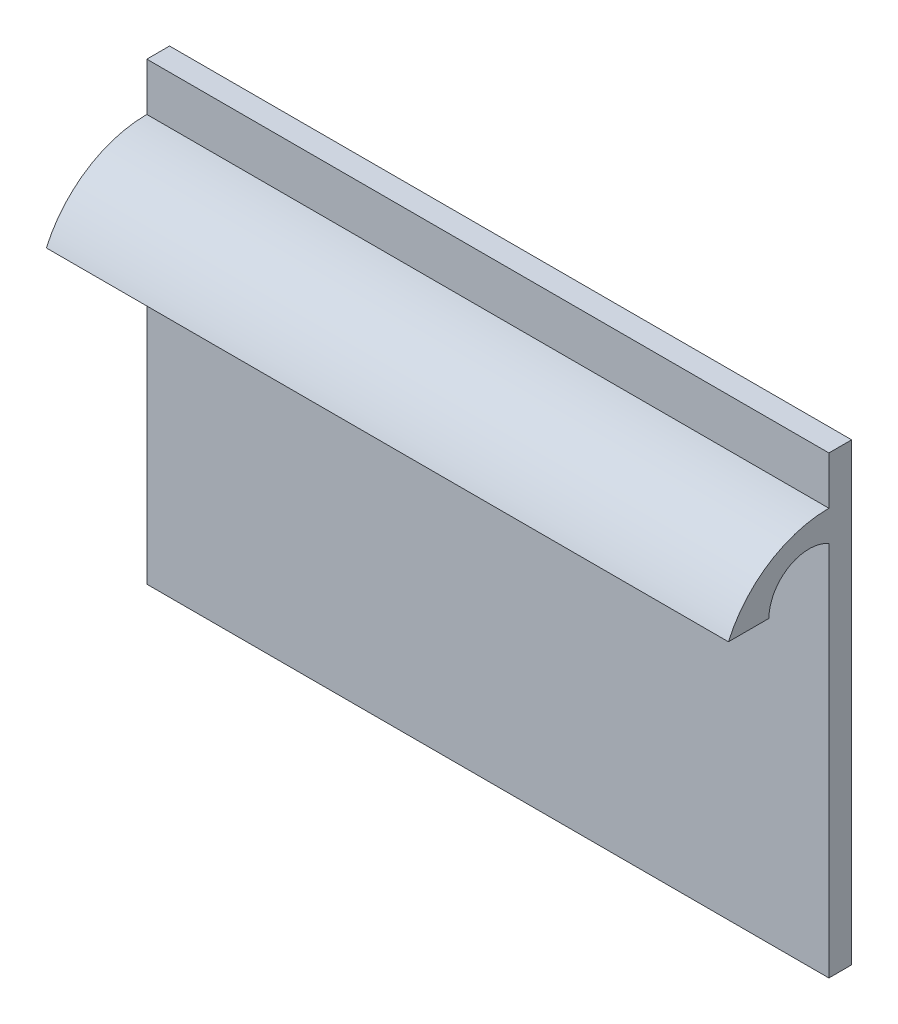
ISO-10303-21;
HEADER;
FILE_DESCRIPTION(('STEP AP214'),'2;1');
FILE_NAME('part.step','',(''),(''),'','','');
FILE_SCHEMA(('AUTOMOTIVE_DESIGN { 1 0 10303 214 1 1 1 1 }'));
ENDSEC;
DATA;
#1=APPLICATION_CONTEXT('core data for automotive mechanical design processes');
#2=APPLICATION_PROTOCOL_DEFINITION('international standard','automotive_design',2000,#1);
#3=PRODUCT_CONTEXT('',#1,'mechanical');
#4=PRODUCT('Part','Part','',(#3));
#5=PRODUCT_RELATED_PRODUCT_CATEGORY('part','',(#4));
#6=PRODUCT_DEFINITION_FORMATION('','',#4);
#7=PRODUCT_DEFINITION_CONTEXT('part definition',#1,'design');
#8=PRODUCT_DEFINITION('design','',#6,#7);
#9=PRODUCT_DEFINITION_SHAPE('','',#8);
#10=(LENGTH_UNIT() NAMED_UNIT(*) SI_UNIT(.MILLI.,.METRE.));
#11=(NAMED_UNIT(*) PLANE_ANGLE_UNIT() SI_UNIT($,.RADIAN.));
#12=(NAMED_UNIT(*) SI_UNIT($,.STERADIAN.) SOLID_ANGLE_UNIT());
#13=UNCERTAINTY_MEASURE_WITH_UNIT(LENGTH_MEASURE(1.E-05),#10,'distance_accuracy_value','');
#14=(GEOMETRIC_REPRESENTATION_CONTEXT(3) GLOBAL_UNCERTAINTY_ASSIGNED_CONTEXT((#13)) GLOBAL_UNIT_ASSIGNED_CONTEXT((#10,
#11,#12)) REPRESENTATION_CONTEXT('',''));
#15=CARTESIAN_POINT('',(0.,0.,0.));
#16=DIRECTION('',(0.,0.,1.));
#17=DIRECTION('',(1.,0.,0.));
#18=AXIS2_PLACEMENT_3D('',#15,#16,#17);
#19=CARTESIAN_POINT('',(0.,0.,10.));
#20=DIRECTION('',(0.,0.,1.));
#21=DIRECTION('',(1.,0.,0.));
#22=AXIS2_PLACEMENT_3D('',#19,#20,#21);
#23=PLANE('',#22);
#24=DIRECTION('',(0.,-1.,0.));
#25=VECTOR('',#24,1.);
#26=CARTESIAN_POINT('',(-150.,100.,10.));
#27=LINE('',#26,#25);
#28=CARTESIAN_POINT('',(-150.,100.,10.));
#29=VERTEX_POINT('',#28);
#30=CARTESIAN_POINT('',(-150.,78.9331796581173,10.));
#31=VERTEX_POINT('',#30);
#32=EDGE_CURVE('E147',#29,#31,#27,.T.);
#33=ORIENTED_EDGE('',*,*,#32,.T.);
#34=DIRECTION('',(1.,0.,0.));
#35=VECTOR('',#34,1.);
#36=CARTESIAN_POINT('',(-150.,78.9331796581173,10.));
#37=LINE('',#36,#35);
#38=CARTESIAN_POINT('',(150.,78.9331796581174,10.));
#39=VERTEX_POINT('',#38);
#40=EDGE_CURVE('E128',#31,#39,#37,.T.);
#41=ORIENTED_EDGE('',*,*,#40,.T.);
#42=DIRECTION('',(0.,1.,0.));
#43=VECTOR('',#42,1.);
#44=CARTESIAN_POINT('',(150.,100.,10.));
#45=LINE('',#44,#43);
#46=CARTESIAN_POINT('',(150.,100.,10.));
#47=VERTEX_POINT('',#46);
#48=EDGE_CURVE('E85',#39,#47,#45,.T.);
#49=ORIENTED_EDGE('',*,*,#48,.T.);
#50=DIRECTION('',(-1.,0.,0.));
#51=VECTOR('',#50,1.);
#52=CARTESIAN_POINT('',(-150.,100.,10.));
#53=LINE('',#52,#51);
#54=EDGE_CURVE('E144',#47,#29,#53,.T.);
#55=ORIENTED_EDGE('',*,*,#54,.T.);
#56=EDGE_LOOP('',(#33,#41,#49,#55));
#57=FACE_BOUND('',#56,.T.);
#58=ADVANCED_FACE('F33',(#57),#23,.T.);
#59=CARTESIAN_POINT('',(150.,100.,10.));
#60=DIRECTION('',(-1.,0.,0.));
#61=DIRECTION('',(0.,-1.,0.));
#62=AXIS2_PLACEMENT_3D('',#59,#60,#61);
#63=PLANE('',#62);
#64=DIRECTION('',(0.,1.,0.));
#65=VECTOR('',#64,1.);
#66=CARTESIAN_POINT('',(150.,100.,0.));
#67=LINE('',#66,#65);
#68=CARTESIAN_POINT('',(150.,-100.,0.));
#69=VERTEX_POINT('',#68);
#70=CARTESIAN_POINT('',(150.,100.,0.));
#71=VERTEX_POINT('',#70);
#72=EDGE_CURVE('E138',#69,#71,#67,.T.);
#73=ORIENTED_EDGE('',*,*,#72,.T.);
#74=DIRECTION('',(0.,0.,-1.));
#75=VECTOR('',#74,1.);
#76=CARTESIAN_POINT('',(150.,100.,10.));
#77=LINE('',#76,#75);
#78=EDGE_CURVE('E11',#47,#71,#77,.T.);
#79=ORIENTED_EDGE('',*,*,#78,.F.);
#80=ORIENTED_EDGE('',*,*,#48,.F.);
#81=CARTESIAN_POINT('',(150.,30.6384327201429,10.));
#82=DIRECTION('',(1.,0.,0.));
#83=DIRECTION('',(0.,1.,0.));
#84=AXIS2_PLACEMENT_3D('',#81,#82,#83);
#85=CIRCLE('',#84,48.2947469379745);
#86=CARTESIAN_POINT('',(150.,50.1540026500254,54.1760694507203));
#87=VERTEX_POINT('',#86);
#88=EDGE_CURVE('E48',#39,#87,#85,.T.);
#89=ORIENTED_EDGE('',*,*,#88,.T.);
#90=DIRECTION('',(0.,0.,-1.));
#91=VECTOR('',#90,1.);
#92=CARTESIAN_POINT('',(150.,50.1540026500254,54.1760694507203));
#93=LINE('',#92,#91);
#94=CARTESIAN_POINT('',(150.,50.1540026500254,36.3617437842129));
#95=VERTEX_POINT('',#94);
#96=EDGE_CURVE('E113',#87,#95,#93,.T.);
#97=ORIENTED_EDGE('',*,*,#96,.T.);
#98=CARTESIAN_POINT('',(150.,50.1540026500254,18.7016400697343));
#99=DIRECTION('',(-1.,0.,0.));
#100=DIRECTION('',(0.,-1.,0.));
#101=AXIS2_PLACEMENT_3D('',#98,#99,#100);
#102=CIRCLE('',#101,17.6601037144786);
#103=CARTESIAN_POINT('',(150.,65.5215243533755,10.));
#104=VERTEX_POINT('',#103);
#105=EDGE_CURVE('E129',#95,#104,#102,.T.);
#106=ORIENTED_EDGE('',*,*,#105,.T.);
#107=CARTESIAN_POINT('',(150.,-100.,10.));
#108=VERTEX_POINT('',#107);
#109=EDGE_CURVE('E142',#108,#104,#45,.T.);
#110=ORIENTED_EDGE('',*,*,#109,.F.);
#111=DIRECTION('',(0.,0.,-1.));
#112=VECTOR('',#111,1.);
#113=CARTESIAN_POINT('',(150.,-100.,10.));
#114=LINE('',#113,#112);
#115=EDGE_CURVE('E150',#108,#69,#114,.T.);
#116=ORIENTED_EDGE('',*,*,#115,.T.);
#117=EDGE_LOOP('',(#73,#79,#80,#89,#97,#106,#110,#116));
#118=FACE_BOUND('',#117,.T.);
#119=ADVANCED_FACE('F35',(#118),#63,.F.);
#120=CARTESIAN_POINT('',(-150.,100.,10.));
#121=DIRECTION('',(0.,-1.,0.));
#122=DIRECTION('',(0.,0.,-1.));
#123=AXIS2_PLACEMENT_3D('',#120,#121,#122);
#124=PLANE('',#123);
#125=DIRECTION('',(-1.,0.,0.));
#126=VECTOR('',#125,1.);
#127=CARTESIAN_POINT('',(-150.,100.,0.));
#128=LINE('',#127,#126);
#129=CARTESIAN_POINT('',(-150.,100.,0.));
#130=VERTEX_POINT('',#129);
#131=EDGE_CURVE('E153',#71,#130,#128,.T.);
#132=ORIENTED_EDGE('',*,*,#131,.T.);
#133=DIRECTION('',(0.,0.,-1.));
#134=VECTOR('',#133,1.);
#135=CARTESIAN_POINT('',(-150.,100.,10.));
#136=LINE('',#135,#134);
#137=EDGE_CURVE('E41',#29,#130,#136,.T.);
#138=ORIENTED_EDGE('',*,*,#137,.F.);
#139=ORIENTED_EDGE('',*,*,#54,.F.);
#140=ORIENTED_EDGE('',*,*,#78,.T.);
#141=EDGE_LOOP('',(#132,#138,#139,#140));
#142=FACE_BOUND('',#141,.T.);
#143=ADVANCED_FACE('F190',(#142),#124,.F.);
#144=CARTESIAN_POINT('',(-150.,100.,10.));
#145=DIRECTION('',(1.,0.,0.));
#146=DIRECTION('',(0.,1.,0.));
#147=AXIS2_PLACEMENT_3D('',#144,#145,#146);
#148=PLANE('',#147);
#149=DIRECTION('',(0.,-1.,0.));
#150=VECTOR('',#149,1.);
#151=CARTESIAN_POINT('',(-150.,100.,0.));
#152=LINE('',#151,#150);
#153=CARTESIAN_POINT('',(-150.,-100.,0.));
#154=VERTEX_POINT('',#153);
#155=EDGE_CURVE('E155',#130,#154,#152,.T.);
#156=ORIENTED_EDGE('',*,*,#155,.T.);
#157=DIRECTION('',(0.,0.,-1.));
#158=VECTOR('',#157,1.);
#159=CARTESIAN_POINT('',(-150.,-100.,10.));
#160=LINE('',#159,#158);
#161=CARTESIAN_POINT('',(-150.,-100.,10.));
#162=VERTEX_POINT('',#161);
#163=EDGE_CURVE('E159',#162,#154,#160,.T.);
#164=ORIENTED_EDGE('',*,*,#163,.F.);
#165=CARTESIAN_POINT('',(-150.,65.5215243533754,10.));
#166=VERTEX_POINT('',#165);
#167=EDGE_CURVE('E146',#166,#162,#27,.T.);
#168=ORIENTED_EDGE('',*,*,#167,.F.);
#169=CARTESIAN_POINT('',(-150.,50.1540026500253,18.7016400697343));
#170=DIRECTION('',(-1.,0.,0.));
#171=DIRECTION('',(0.,-1.,0.));
#172=AXIS2_PLACEMENT_3D('',#169,#170,#171);
#173=CIRCLE('',#172,17.6601037144786);
#174=CARTESIAN_POINT('',(-150.,50.1540026500253,36.3617437842129));
#175=VERTEX_POINT('',#174);
#176=EDGE_CURVE('E116',#175,#166,#173,.T.);
#177=ORIENTED_EDGE('',*,*,#176,.F.);
#178=DIRECTION('',(0.,0.,-1.));
#179=VECTOR('',#178,1.);
#180=CARTESIAN_POINT('',(-150.,50.1540026500253,54.1760694507203));
#181=LINE('',#180,#179);
#182=CARTESIAN_POINT('',(-150.,50.1540026500253,54.1760694507203));
#183=VERTEX_POINT('',#182);
#184=EDGE_CURVE('E111',#183,#175,#181,.T.);
#185=ORIENTED_EDGE('',*,*,#184,.F.);
#186=CARTESIAN_POINT('',(-150.,30.6384327201428,10.));
#187=DIRECTION('',(1.,0.,0.));
#188=DIRECTION('',(0.,1.,0.));
#189=AXIS2_PLACEMENT_3D('',#186,#187,#188);
#190=CIRCLE('',#189,48.2947469379745);
#191=EDGE_CURVE('E123',#31,#183,#190,.T.);
#192=ORIENTED_EDGE('',*,*,#191,.F.);
#193=ORIENTED_EDGE('',*,*,#32,.F.);
#194=ORIENTED_EDGE('',*,*,#137,.T.);
#195=EDGE_LOOP('',(#156,#164,#168,#177,#185,#192,#193,#194));
#196=FACE_BOUND('',#195,.T.);
#197=ADVANCED_FACE('F121',(#196),#148,.F.);
#198=CARTESIAN_POINT('',(-150.,-100.,10.));
#199=DIRECTION('',(0.,1.,0.));
#200=DIRECTION('',(0.,0.,1.));
#201=AXIS2_PLACEMENT_3D('',#198,#199,#200);
#202=PLANE('',#201);
#203=DIRECTION('',(1.,0.,0.));
#204=VECTOR('',#203,1.);
#205=CARTESIAN_POINT('',(-150.,-100.,0.));
#206=LINE('',#205,#204);
#207=EDGE_CURVE('E78',#154,#69,#206,.T.);
#208=ORIENTED_EDGE('',*,*,#207,.T.);
#209=ORIENTED_EDGE('',*,*,#115,.F.);
#210=DIRECTION('',(1.,0.,0.));
#211=VECTOR('',#210,1.);
#212=CARTESIAN_POINT('',(-150.,-100.,10.));
#213=LINE('',#212,#211);
#214=EDGE_CURVE('E57',#162,#108,#213,.T.);
#215=ORIENTED_EDGE('',*,*,#214,.F.);
#216=ORIENTED_EDGE('',*,*,#163,.T.);
#217=EDGE_LOOP('',(#208,#209,#215,#216));
#218=FACE_BOUND('',#217,.T.);
#219=ADVANCED_FACE('F171',(#218),#202,.F.);
#220=DIRECTION('',(1.,0.,0.));
#221=VECTOR('',#220,1.);
#222=CARTESIAN_POINT('',(-150.,65.5215243533754,10.));
#223=LINE('',#222,#221);
#224=EDGE_CURVE('E139',#166,#104,#223,.T.);
#225=ORIENTED_EDGE('',*,*,#224,.F.);
#226=ORIENTED_EDGE('',*,*,#167,.T.);
#227=ORIENTED_EDGE('',*,*,#214,.T.);
#228=ORIENTED_EDGE('',*,*,#109,.T.);
#229=EDGE_LOOP('',(#225,#226,#227,#228));
#230=FACE_BOUND('',#229,.T.);
#231=ADVANCED_FACE('F173',(#230),#23,.T.);
#232=CARTESIAN_POINT('',(0.,0.,0.));
#233=DIRECTION('',(0.,0.,1.));
#234=DIRECTION('',(1.,0.,0.));
#235=AXIS2_PLACEMENT_3D('',#232,#233,#234);
#236=PLANE('',#235);
#237=ORIENTED_EDGE('',*,*,#72,.F.);
#238=ORIENTED_EDGE('',*,*,#207,.F.);
#239=ORIENTED_EDGE('',*,*,#155,.F.);
#240=ORIENTED_EDGE('',*,*,#131,.F.);
#241=EDGE_LOOP('',(#237,#238,#239,#240));
#242=FACE_BOUND('',#241,.T.);
#243=ADVANCED_FACE('F167',(#242),#236,.F.);
#244=CARTESIAN_POINT('',(-150.,30.6384327201428,10.));
#245=DIRECTION('',(1.,0.,0.));
#246=DIRECTION('',(0.,1.,0.));
#247=AXIS2_PLACEMENT_3D('',#244,#245,#246);
#248=CYLINDRICAL_SURFACE('',#247,48.2947469379745);
#249=ORIENTED_EDGE('',*,*,#88,.F.);
#250=ORIENTED_EDGE('',*,*,#40,.F.);
#251=ORIENTED_EDGE('',*,*,#191,.T.);
#252=DIRECTION('',(1.,0.,0.));
#253=VECTOR('',#252,1.);
#254=CARTESIAN_POINT('',(-150.,50.1540026500253,54.1760694507203));
#255=LINE('',#254,#253);
#256=EDGE_CURVE('E108',#183,#87,#255,.T.);
#257=ORIENTED_EDGE('',*,*,#256,.T.);
#258=EDGE_LOOP('',(#249,#250,#251,#257));
#259=FACE_BOUND('',#258,.T.);
#260=ADVANCED_FACE('F127',(#259),#248,.T.);
#261=CARTESIAN_POINT('',(-150.,50.1540026500253,18.7016400697343));
#262=DIRECTION('',(1.,0.,0.));
#263=DIRECTION('',(0.,1.,0.));
#264=AXIS2_PLACEMENT_3D('',#261,#262,#263);
#265=CYLINDRICAL_SURFACE('',#264,17.6601037144786);
#266=ORIENTED_EDGE('',*,*,#105,.F.);
#267=DIRECTION('',(1.,0.,0.));
#268=VECTOR('',#267,1.);
#269=CARTESIAN_POINT('',(-150.,50.1540026500253,36.3617437842129));
#270=LINE('',#269,#268);
#271=EDGE_CURVE('E115',#175,#95,#270,.T.);
#272=ORIENTED_EDGE('',*,*,#271,.F.);
#273=ORIENTED_EDGE('',*,*,#176,.T.);
#274=ORIENTED_EDGE('',*,*,#224,.T.);
#275=EDGE_LOOP('',(#266,#272,#273,#274));
#276=FACE_BOUND('',#275,.T.);
#277=ADVANCED_FACE('F176',(#276),#265,.F.);
#278=CARTESIAN_POINT('',(-150.,50.1540026500253,54.1760694507203));
#279=DIRECTION('',(0.,-1.,0.));
#280=DIRECTION('',(1.,0.,0.));
#281=AXIS2_PLACEMENT_3D('',#278,#279,#280);
#282=PLANE('',#281);
#283=ORIENTED_EDGE('',*,*,#96,.F.);
#284=ORIENTED_EDGE('',*,*,#256,.F.);
#285=ORIENTED_EDGE('',*,*,#184,.T.);
#286=ORIENTED_EDGE('',*,*,#271,.T.);
#287=EDGE_LOOP('',(#283,#284,#285,#286));
#288=FACE_BOUND('',#287,.T.);
#289=ADVANCED_FACE('F110',(#288),#282,.T.);
#290=CLOSED_SHELL('',(#58,#119,#143,#197,#219,#231,#243,#260,#277,#289));
#291=MANIFOLD_SOLID_BREP('B2',#290);
#292=ADVANCED_BREP_SHAPE_REPRESENTATION('',(#18,#291),#14);
#293=SHAPE_DEFINITION_REPRESENTATION(#9,#292);
ENDSEC;
END-ISO-10303-21;
